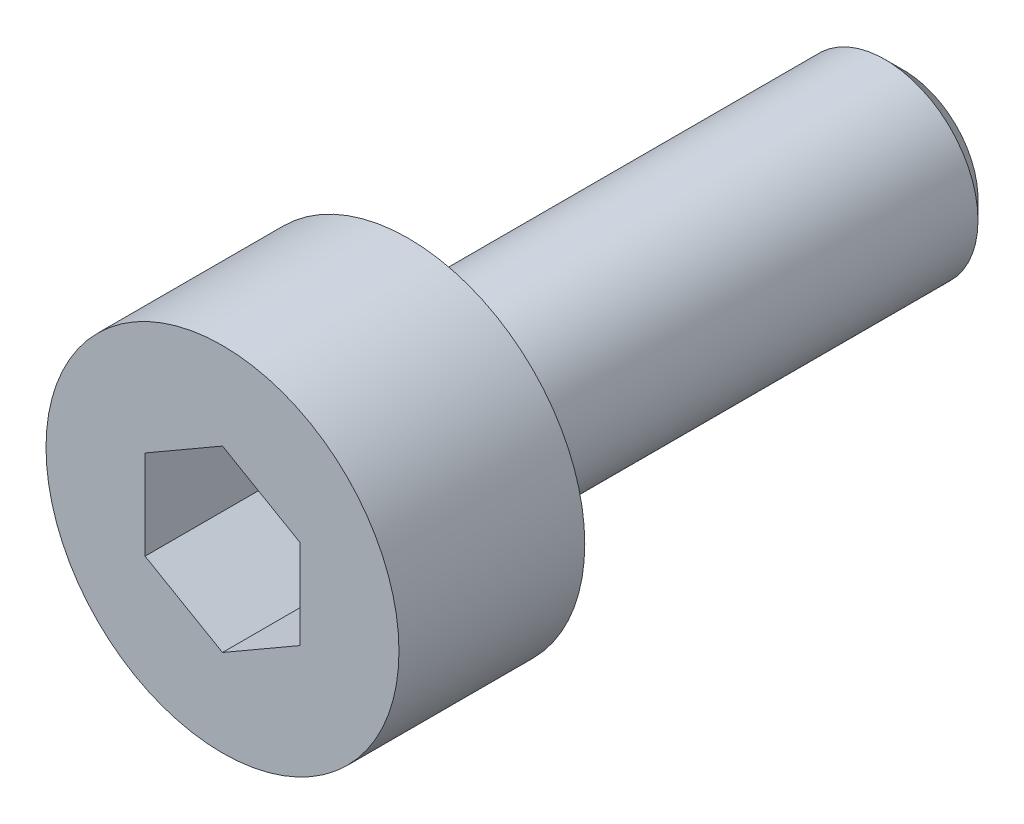
ISO-10303-21;
HEADER;
FILE_DESCRIPTION(('STEP AP214'),'2;1');
FILE_NAME('part.step','',(''),(''),'','','');
FILE_SCHEMA(('AUTOMOTIVE_DESIGN { 1 0 10303 214 1 1 1 1 }'));
ENDSEC;
DATA;
#1=APPLICATION_CONTEXT('core data for automotive mechanical design processes');
#2=APPLICATION_PROTOCOL_DEFINITION('international standard','automotive_design',2000,#1);
#3=PRODUCT_CONTEXT('',#1,'mechanical');
#4=PRODUCT('Part','Part','',(#3));
#5=PRODUCT_RELATED_PRODUCT_CATEGORY('part','',(#4));
#6=PRODUCT_DEFINITION_FORMATION('','',#4);
#7=PRODUCT_DEFINITION_CONTEXT('part definition',#1,'design');
#8=PRODUCT_DEFINITION('design','',#6,#7);
#9=PRODUCT_DEFINITION_SHAPE('','',#8);
#10=(LENGTH_UNIT() NAMED_UNIT(*) SI_UNIT(.MILLI.,.METRE.));
#11=(NAMED_UNIT(*) PLANE_ANGLE_UNIT() SI_UNIT($,.RADIAN.));
#12=(NAMED_UNIT(*) SI_UNIT($,.STERADIAN.) SOLID_ANGLE_UNIT());
#13=UNCERTAINTY_MEASURE_WITH_UNIT(LENGTH_MEASURE(1.E-05),#10,'distance_accuracy_value','');
#14=(GEOMETRIC_REPRESENTATION_CONTEXT(3) GLOBAL_UNCERTAINTY_ASSIGNED_CONTEXT((#13)) GLOBAL_UNIT_ASSIGNED_CONTEXT((#10,
#11,#12)) REPRESENTATION_CONTEXT('',''));
#15=CARTESIAN_POINT('',(0.,0.,0.));
#16=DIRECTION('',(0.,0.,1.));
#17=DIRECTION('',(1.,0.,0.));
#18=AXIS2_PLACEMENT_3D('',#15,#16,#17);
#19=CARTESIAN_POINT('',(0.,0.,0.));
#20=DIRECTION('',(0.,0.,1.));
#21=DIRECTION('',(1.,0.,0.));
#22=AXIS2_PLACEMENT_3D('',#19,#20,#21);
#23=PLANE('',#22);
#24=CARTESIAN_POINT('',(0.,0.,0.));
#25=DIRECTION('',(0.,0.,1.));
#26=DIRECTION('',(1.,0.,0.));
#27=AXIS2_PLACEMENT_3D('',#24,#25,#26);
#28=CIRCLE('',#27,2.85);
#29=CARTESIAN_POINT('',(2.85,0.,0.));
#30=VERTEX_POINT('',#29);
#31=EDGE_CURVE('E138',#30,#30,#28,.T.);
#32=ORIENTED_EDGE('',*,*,#31,.F.);
#33=EDGE_LOOP('',(#32));
#34=FACE_BOUND('',#33,.T.);
#35=CARTESIAN_POINT('',(0.,0.,0.));
#36=DIRECTION('',(0.,0.,1.));
#37=DIRECTION('',(1.,0.,0.));
#38=AXIS2_PLACEMENT_3D('',#35,#36,#37);
#39=CIRCLE('',#38,1.5);
#40=CARTESIAN_POINT('',(1.5,0.,0.));
#41=VERTEX_POINT('',#40);
#42=EDGE_CURVE('E147',#41,#41,#39,.F.);
#43=ORIENTED_EDGE('',*,*,#42,.F.);
#44=EDGE_LOOP('',(#43));
#45=FACE_BOUND('',#44,.T.);
#46=ADVANCED_FACE('F36',(#34,#45),#23,.F.);
#47=CARTESIAN_POINT('',(0.,0.,3.));
#48=DIRECTION('',(0.,0.,-1.));
#49=DIRECTION('',(-1.,0.,0.));
#50=AXIS2_PLACEMENT_3D('',#47,#48,#49);
#51=CYLINDRICAL_SURFACE('',#50,2.85);
#52=CARTESIAN_POINT('',(0.,0.,3.));
#53=DIRECTION('',(0.,0.,1.));
#54=DIRECTION('',(1.,0.,0.));
#55=AXIS2_PLACEMENT_3D('',#52,#53,#54);
#56=CIRCLE('',#55,2.85);
#57=CARTESIAN_POINT('',(2.85,0.,3.));
#58=VERTEX_POINT('',#57);
#59=EDGE_CURVE('E144',#58,#58,#56,.T.);
#60=ORIENTED_EDGE('',*,*,#59,.F.);
#61=EDGE_LOOP('',(#60));
#62=FACE_BOUND('',#61,.T.);
#63=ORIENTED_EDGE('',*,*,#31,.T.);
#64=EDGE_LOOP('',(#63));
#65=FACE_BOUND('',#64,.T.);
#66=ADVANCED_FACE('F169',(#62,#65),#51,.T.);
#67=CARTESIAN_POINT('',(0.,0.,3.));
#68=DIRECTION('',(0.,0.,1.));
#69=DIRECTION('',(1.,0.,0.));
#70=AXIS2_PLACEMENT_3D('',#67,#68,#69);
#71=PLANE('',#70);
#72=DIRECTION('',(-0.866025403784439,0.5,0.));
#73=VECTOR('',#72,1.);
#74=CARTESIAN_POINT('',(1.25,0.721687836487032,3.));
#75=LINE('',#74,#73);
#76=CARTESIAN_POINT('',(1.25,0.721687836487032,3.));
#77=VERTEX_POINT('',#76);
#78=CARTESIAN_POINT('',(0.,1.44337567297406,3.));
#79=VERTEX_POINT('',#78);
#80=EDGE_CURVE('E51',#77,#79,#75,.T.);
#81=ORIENTED_EDGE('',*,*,#80,.F.);
#82=DIRECTION('',(0.,1.,0.));
#83=VECTOR('',#82,1.);
#84=CARTESIAN_POINT('',(1.25,-0.721687836487032,3.));
#85=LINE('',#84,#83);
#86=CARTESIAN_POINT('',(1.25,-0.721687836487032,3.));
#87=VERTEX_POINT('',#86);
#88=EDGE_CURVE('E134',#87,#77,#85,.T.);
#89=ORIENTED_EDGE('',*,*,#88,.F.);
#90=DIRECTION('',(0.866025403784439,0.5,0.));
#91=VECTOR('',#90,1.);
#92=CARTESIAN_POINT('',(0.,-1.44337567297406,3.));
#93=LINE('',#92,#91);
#94=CARTESIAN_POINT('',(0.,-1.44337567297406,3.));
#95=VERTEX_POINT('',#94);
#96=EDGE_CURVE('E132',#95,#87,#93,.T.);
#97=ORIENTED_EDGE('',*,*,#96,.F.);
#98=DIRECTION('',(0.866025403784439,-0.5,0.));
#99=VECTOR('',#98,1.);
#100=CARTESIAN_POINT('',(-1.25,-0.721687836487033,3.));
#101=LINE('',#100,#99);
#102=CARTESIAN_POINT('',(-1.25,-0.721687836487033,3.));
#103=VERTEX_POINT('',#102);
#104=EDGE_CURVE('E99',#103,#95,#101,.T.);
#105=ORIENTED_EDGE('',*,*,#104,.F.);
#106=DIRECTION('',(0.,-1.,0.));
#107=VECTOR('',#106,1.);
#108=CARTESIAN_POINT('',(-1.25,0.721687836487032,3.));
#109=LINE('',#108,#107);
#110=CARTESIAN_POINT('',(-1.25,0.721687836487032,3.));
#111=VERTEX_POINT('',#110);
#112=EDGE_CURVE('E128',#111,#103,#109,.T.);
#113=ORIENTED_EDGE('',*,*,#112,.F.);
#114=DIRECTION('',(-0.866025403784439,-0.5,0.));
#115=VECTOR('',#114,1.);
#116=CARTESIAN_POINT('',(0.,1.44337567297406,3.));
#117=LINE('',#116,#115);
#118=EDGE_CURVE('E125',#79,#111,#117,.T.);
#119=ORIENTED_EDGE('',*,*,#118,.F.);
#120=EDGE_LOOP('',(#81,#89,#97,#105,#113,#119));
#121=FACE_BOUND('',#120,.T.);
#122=ORIENTED_EDGE('',*,*,#59,.T.);
#123=EDGE_LOOP('',(#122));
#124=FACE_BOUND('',#123,.T.);
#125=ADVANCED_FACE('F175',(#121,#124),#71,.T.);
#126=CARTESIAN_POINT('',(0.,0.,-8.));
#127=DIRECTION('',(0.,0.,1.));
#128=DIRECTION('',(1.,0.,0.));
#129=AXIS2_PLACEMENT_3D('',#126,#127,#128);
#130=CYLINDRICAL_SURFACE('',#129,1.5);
#131=CARTESIAN_POINT('',(0.,0.,-7.7));
#132=DIRECTION('',(0.,0.,-1.));
#133=DIRECTION('',(-1.,0.,0.));
#134=AXIS2_PLACEMENT_3D('',#131,#132,#133);
#135=CIRCLE('',#134,1.5);
#136=CARTESIAN_POINT('',(-1.5,0.,-7.7));
#137=VERTEX_POINT('',#136);
#138=EDGE_CURVE('E11',#137,#137,#135,.F.);
#139=ORIENTED_EDGE('',*,*,#138,.T.);
#140=EDGE_LOOP('',(#139));
#141=FACE_BOUND('',#140,.T.);
#142=ORIENTED_EDGE('',*,*,#42,.T.);
#143=EDGE_LOOP('',(#142));
#144=FACE_BOUND('',#143,.T.);
#145=ADVANCED_FACE('F165',(#141,#144),#130,.T.);
#146=CARTESIAN_POINT('',(0.,0.,-8.));
#147=DIRECTION('',(0.,0.,-1.));
#148=DIRECTION('',(-1.,0.,0.));
#149=AXIS2_PLACEMENT_3D('',#146,#147,#148);
#150=PLANE('',#149);
#151=CARTESIAN_POINT('',(0.,0.,-8.));
#152=DIRECTION('',(0.,0.,-1.));
#153=DIRECTION('',(-1.,0.,0.));
#154=AXIS2_PLACEMENT_3D('',#151,#152,#153);
#155=CIRCLE('',#154,1.2);
#156=CARTESIAN_POINT('',(-1.2,0.,-8.));
#157=VERTEX_POINT('',#156);
#158=EDGE_CURVE('E44',#157,#157,#155,.T.);
#159=ORIENTED_EDGE('',*,*,#158,.T.);
#160=EDGE_LOOP('',(#159));
#161=FACE_BOUND('',#160,.T.);
#162=ADVANCED_FACE('F154',(#161),#150,.T.);
#163=CARTESIAN_POINT('',(0.,0.,-8.));
#164=DIRECTION('',(0.,0.,1.));
#165=DIRECTION('',(1.,0.,0.));
#166=AXIS2_PLACEMENT_3D('',#163,#164,#165);
#167=CONICAL_SURFACE('',#166,1.2,0.785398163397449);
#168=ORIENTED_EDGE('',*,*,#138,.F.);
#169=EDGE_LOOP('',(#168));
#170=FACE_BOUND('',#169,.T.);
#171=ORIENTED_EDGE('',*,*,#158,.F.);
#172=EDGE_LOOP('',(#171));
#173=FACE_BOUND('',#172,.T.);
#174=ADVANCED_FACE('F38',(#170,#173),#167,.T.);
#175=CARTESIAN_POINT('',(1.25,0.721687836487032,1.));
#176=DIRECTION('',(0.5,0.866025403784439,0.));
#177=DIRECTION('',(-0.866025403784439,0.5,0.));
#178=AXIS2_PLACEMENT_3D('',#175,#176,#177);
#179=PLANE('',#178);
#180=ORIENTED_EDGE('',*,*,#80,.T.);
#181=DIRECTION('',(0.,0.,1.));
#182=VECTOR('',#181,1.);
#183=CARTESIAN_POINT('',(0.,1.44337567297406,1.));
#184=LINE('',#183,#182);
#185=CARTESIAN_POINT('',(0.,1.44337567297406,1.));
#186=VERTEX_POINT('',#185);
#187=EDGE_CURVE('E81',#186,#79,#184,.T.);
#188=ORIENTED_EDGE('',*,*,#187,.F.);
#189=DIRECTION('',(-0.866025403784439,0.5,0.));
#190=VECTOR('',#189,1.);
#191=CARTESIAN_POINT('',(1.25,0.721687836487032,1.));
#192=LINE('',#191,#190);
#193=CARTESIAN_POINT('',(1.25,0.721687836487032,1.));
#194=VERTEX_POINT('',#193);
#195=EDGE_CURVE('E136',#194,#186,#192,.T.);
#196=ORIENTED_EDGE('',*,*,#195,.F.);
#197=DIRECTION('',(0.,0.,1.));
#198=VECTOR('',#197,1.);
#199=CARTESIAN_POINT('',(1.25,0.721687836487032,1.));
#200=LINE('',#199,#198);
#201=EDGE_CURVE('E59',#194,#77,#200,.T.);
#202=ORIENTED_EDGE('',*,*,#201,.T.);
#203=EDGE_LOOP('',(#180,#188,#196,#202));
#204=FACE_BOUND('',#203,.T.);
#205=ADVANCED_FACE('F157',(#204),#179,.F.);
#206=CARTESIAN_POINT('',(1.25,-0.721687836487032,1.));
#207=DIRECTION('',(1.,0.,0.));
#208=DIRECTION('',(0.,1.,0.));
#209=AXIS2_PLACEMENT_3D('',#206,#207,#208);
#210=PLANE('',#209);
#211=ORIENTED_EDGE('',*,*,#88,.T.);
#212=ORIENTED_EDGE('',*,*,#201,.F.);
#213=DIRECTION('',(0.,1.,0.));
#214=VECTOR('',#213,1.);
#215=CARTESIAN_POINT('',(1.25,-0.721687836487032,1.));
#216=LINE('',#215,#214);
#217=CARTESIAN_POINT('',(1.25,-0.721687836487032,1.));
#218=VERTEX_POINT('',#217);
#219=EDGE_CURVE('E111',#218,#194,#216,.T.);
#220=ORIENTED_EDGE('',*,*,#219,.F.);
#221=DIRECTION('',(0.,0.,1.));
#222=VECTOR('',#221,1.);
#223=CARTESIAN_POINT('',(1.25,-0.721687836487032,1.));
#224=LINE('',#223,#222);
#225=EDGE_CURVE('E103',#218,#87,#224,.T.);
#226=ORIENTED_EDGE('',*,*,#225,.T.);
#227=EDGE_LOOP('',(#211,#212,#220,#226));
#228=FACE_BOUND('',#227,.T.);
#229=ADVANCED_FACE('F163',(#228),#210,.F.);
#230=CARTESIAN_POINT('',(0.,-1.44337567297406,1.));
#231=DIRECTION('',(0.5,-0.866025403784439,0.));
#232=DIRECTION('',(0.866025403784439,0.5,0.));
#233=AXIS2_PLACEMENT_3D('',#230,#231,#232);
#234=PLANE('',#233);
#235=ORIENTED_EDGE('',*,*,#96,.T.);
#236=ORIENTED_EDGE('',*,*,#225,.F.);
#237=DIRECTION('',(0.866025403784439,0.5,0.));
#238=VECTOR('',#237,1.);
#239=CARTESIAN_POINT('',(0.,-1.44337567297406,1.));
#240=LINE('',#239,#238);
#241=CARTESIAN_POINT('',(0.,-1.44337567297406,1.));
#242=VERTEX_POINT('',#241);
#243=EDGE_CURVE('E107',#242,#218,#240,.T.);
#244=ORIENTED_EDGE('',*,*,#243,.F.);
#245=DIRECTION('',(0.,0.,1.));
#246=VECTOR('',#245,1.);
#247=CARTESIAN_POINT('',(0.,-1.44337567297406,1.));
#248=LINE('',#247,#246);
#249=EDGE_CURVE('E92',#242,#95,#248,.T.);
#250=ORIENTED_EDGE('',*,*,#249,.T.);
#251=EDGE_LOOP('',(#235,#236,#244,#250));
#252=FACE_BOUND('',#251,.T.);
#253=ADVANCED_FACE('F108',(#252),#234,.F.);
#254=CARTESIAN_POINT('',(-1.25,-0.721687836487033,1.));
#255=DIRECTION('',(-0.5,-0.866025403784439,0.));
#256=DIRECTION('',(0.866025403784439,-0.5,0.));
#257=AXIS2_PLACEMENT_3D('',#254,#255,#256);
#258=PLANE('',#257);
#259=ORIENTED_EDGE('',*,*,#104,.T.);
#260=ORIENTED_EDGE('',*,*,#249,.F.);
#261=DIRECTION('',(0.866025403784439,-0.5,0.));
#262=VECTOR('',#261,1.);
#263=CARTESIAN_POINT('',(-1.25,-0.721687836487033,1.));
#264=LINE('',#263,#262);
#265=CARTESIAN_POINT('',(-1.25,-0.721687836487033,1.));
#266=VERTEX_POINT('',#265);
#267=EDGE_CURVE('E96',#266,#242,#264,.T.);
#268=ORIENTED_EDGE('',*,*,#267,.F.);
#269=DIRECTION('',(0.,0.,1.));
#270=VECTOR('',#269,1.);
#271=CARTESIAN_POINT('',(-1.25,-0.721687836487033,1.));
#272=LINE('',#271,#270);
#273=EDGE_CURVE('E104',#266,#103,#272,.T.);
#274=ORIENTED_EDGE('',*,*,#273,.T.);
#275=EDGE_LOOP('',(#259,#260,#268,#274));
#276=FACE_BOUND('',#275,.T.);
#277=ADVANCED_FACE('F94',(#276),#258,.F.);
#278=CARTESIAN_POINT('',(-1.25,0.721687836487032,1.));
#279=DIRECTION('',(-1.,0.,0.));
#280=DIRECTION('',(0.,0.,1.));
#281=AXIS2_PLACEMENT_3D('',#278,#279,#280);
#282=PLANE('',#281);
#283=ORIENTED_EDGE('',*,*,#112,.T.);
#284=ORIENTED_EDGE('',*,*,#273,.F.);
#285=DIRECTION('',(0.,-1.,0.));
#286=VECTOR('',#285,1.);
#287=CARTESIAN_POINT('',(-1.25,0.721687836487032,1.));
#288=LINE('',#287,#286);
#289=CARTESIAN_POINT('',(-1.25,0.721687836487032,1.));
#290=VERTEX_POINT('',#289);
#291=EDGE_CURVE('E117',#290,#266,#288,.T.);
#292=ORIENTED_EDGE('',*,*,#291,.F.);
#293=DIRECTION('',(0.,0.,1.));
#294=VECTOR('',#293,1.);
#295=CARTESIAN_POINT('',(-1.25,0.721687836487032,1.));
#296=LINE('',#295,#294);
#297=EDGE_CURVE('E141',#290,#111,#296,.T.);
#298=ORIENTED_EDGE('',*,*,#297,.T.);
#299=EDGE_LOOP('',(#283,#284,#292,#298));
#300=FACE_BOUND('',#299,.T.);
#301=ADVANCED_FACE('F189',(#300),#282,.F.);
#302=CARTESIAN_POINT('',(0.,1.44337567297406,1.));
#303=DIRECTION('',(-0.5,0.866025403784439,0.));
#304=DIRECTION('',(-0.866025403784439,-0.5,0.));
#305=AXIS2_PLACEMENT_3D('',#302,#303,#304);
#306=PLANE('',#305);
#307=ORIENTED_EDGE('',*,*,#118,.T.);
#308=ORIENTED_EDGE('',*,*,#297,.F.);
#309=DIRECTION('',(-0.866025403784439,-0.5,0.));
#310=VECTOR('',#309,1.);
#311=CARTESIAN_POINT('',(0.,1.44337567297406,1.));
#312=LINE('',#311,#310);
#313=EDGE_CURVE('E119',#186,#290,#312,.T.);
#314=ORIENTED_EDGE('',*,*,#313,.F.);
#315=ORIENTED_EDGE('',*,*,#187,.T.);
#316=EDGE_LOOP('',(#307,#308,#314,#315));
#317=FACE_BOUND('',#316,.T.);
#318=ADVANCED_FACE('F186',(#317),#306,.F.);
#319=CARTESIAN_POINT('',(0.,0.,1.));
#320=DIRECTION('',(0.,0.,1.));
#321=DIRECTION('',(1.,0.,0.));
#322=AXIS2_PLACEMENT_3D('',#319,#320,#321);
#323=PLANE('',#322);
#324=ORIENTED_EDGE('',*,*,#195,.T.);
#325=ORIENTED_EDGE('',*,*,#313,.T.);
#326=ORIENTED_EDGE('',*,*,#291,.T.);
#327=ORIENTED_EDGE('',*,*,#267,.T.);
#328=ORIENTED_EDGE('',*,*,#243,.T.);
#329=ORIENTED_EDGE('',*,*,#219,.T.);
#330=EDGE_LOOP('',(#324,#325,#326,#327,#328,#329));
#331=FACE_BOUND('',#330,.T.);
#332=ADVANCED_FACE('F114',(#331),#323,.T.);
#333=CLOSED_SHELL('',(#46,#66,#125,#145,#162,#174,#205,#229,#253,#277,#301,#318,#332));
#334=MANIFOLD_SOLID_BREP('B2',#333);
#335=ADVANCED_BREP_SHAPE_REPRESENTATION('',(#18,#334),#14);
#336=SHAPE_DEFINITION_REPRESENTATION(#9,#335);
ENDSEC;
END-ISO-10303-21;
